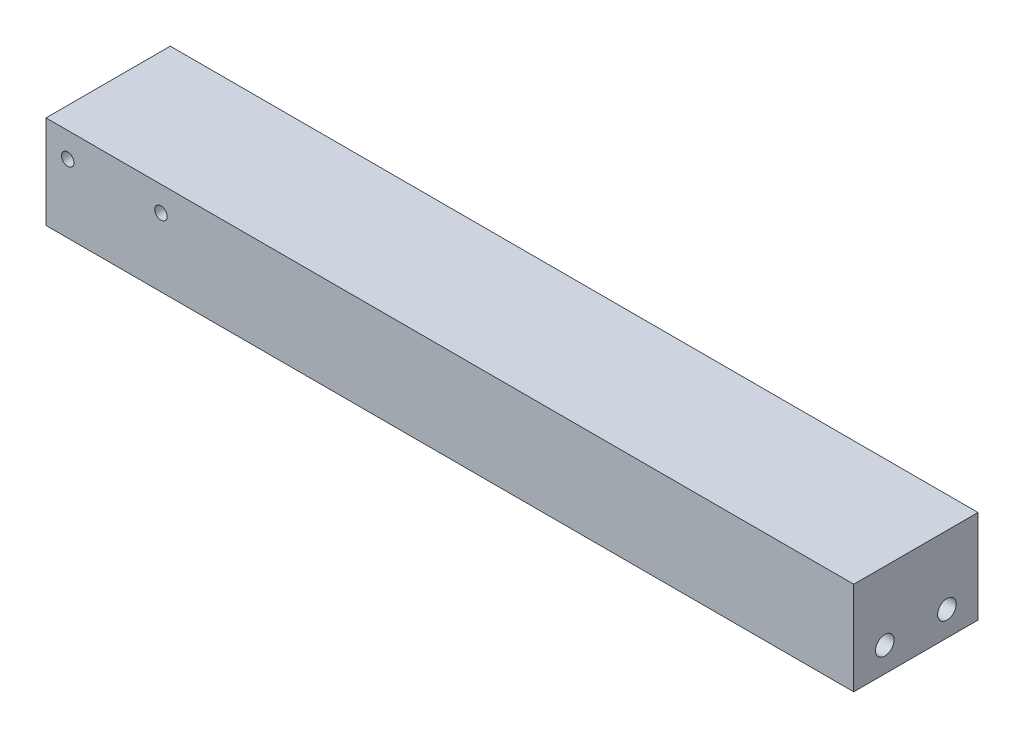
ISO-10303-21;
HEADER;
FILE_DESCRIPTION(('STEP AP214'),'2;1');
FILE_NAME('part.step','',(''),(''),'','','');
FILE_SCHEMA(('AUTOMOTIVE_DESIGN { 1 0 10303 214 1 1 1 1 }'));
ENDSEC;
DATA;
#1=APPLICATION_CONTEXT('core data for automotive mechanical design processes');
#2=APPLICATION_PROTOCOL_DEFINITION('international standard','automotive_design',2000,#1);
#3=PRODUCT_CONTEXT('',#1,'mechanical');
#4=PRODUCT('Part','Part','',(#3));
#5=PRODUCT_RELATED_PRODUCT_CATEGORY('part','',(#4));
#6=PRODUCT_DEFINITION_FORMATION('','',#4);
#7=PRODUCT_DEFINITION_CONTEXT('part definition',#1,'design');
#8=PRODUCT_DEFINITION('design','',#6,#7);
#9=PRODUCT_DEFINITION_SHAPE('','',#8);
#10=(LENGTH_UNIT() NAMED_UNIT(*) SI_UNIT(.MILLI.,.METRE.));
#11=(NAMED_UNIT(*) PLANE_ANGLE_UNIT() SI_UNIT($,.RADIAN.));
#12=(NAMED_UNIT(*) SI_UNIT($,.STERADIAN.) SOLID_ANGLE_UNIT());
#13=UNCERTAINTY_MEASURE_WITH_UNIT(LENGTH_MEASURE(1.E-05),#10,'distance_accuracy_value','');
#14=(GEOMETRIC_REPRESENTATION_CONTEXT(3) GLOBAL_UNCERTAINTY_ASSIGNED_CONTEXT((#13)) GLOBAL_UNIT_ASSIGNED_CONTEXT((#10,
#11,#12)) REPRESENTATION_CONTEXT('',''));
#15=CARTESIAN_POINT('',(0.,0.,0.));
#16=DIRECTION('',(0.,0.,1.));
#17=DIRECTION('',(1.,0.,0.));
#18=AXIS2_PLACEMENT_3D('',#15,#16,#17);
#19=CARTESIAN_POINT('',(0.,0.,40.));
#20=DIRECTION('',(1.,0.,0.));
#21=DIRECTION('',(0.,0.,-1.));
#22=AXIS2_PLACEMENT_3D('',#19,#20,#21);
#23=PLANE('',#22);
#24=CARTESIAN_POINT('',(0.,8.,10.));
#25=DIRECTION('',(1.,0.,0.));
#26=DIRECTION('',(0.,0.,-1.));
#27=AXIS2_PLACEMENT_3D('',#24,#25,#26);
#28=CIRCLE('',#27,3.);
#29=CARTESIAN_POINT('',(0.,8.,7.));
#30=VERTEX_POINT('',#29);
#31=EDGE_CURVE('E118',#30,#30,#28,.T.);
#32=ORIENTED_EDGE('',*,*,#31,.T.);
#33=EDGE_LOOP('',(#32));
#34=FACE_BOUND('',#33,.T.);
#35=CARTESIAN_POINT('',(0.,8.,30.));
#36=DIRECTION('',(1.,0.,0.));
#37=DIRECTION('',(0.,0.,-1.));
#38=AXIS2_PLACEMENT_3D('',#35,#36,#37);
#39=CIRCLE('',#38,3.);
#40=CARTESIAN_POINT('',(0.,8.,27.));
#41=VERTEX_POINT('',#40);
#42=EDGE_CURVE('E129',#41,#41,#39,.T.);
#43=ORIENTED_EDGE('',*,*,#42,.T.);
#44=EDGE_LOOP('',(#43));
#45=FACE_BOUND('',#44,.T.);
#46=DIRECTION('',(0.,-1.,0.));
#47=VECTOR('',#46,1.);
#48=CARTESIAN_POINT('',(0.,0.,0.));
#49=LINE('',#48,#47);
#50=CARTESIAN_POINT('',(0.,30.,0.));
#51=VERTEX_POINT('',#50);
#52=CARTESIAN_POINT('',(0.,0.,0.));
#53=VERTEX_POINT('',#52);
#54=EDGE_CURVE('E100',#51,#53,#49,.T.);
#55=ORIENTED_EDGE('',*,*,#54,.T.);
#56=DIRECTION('',(0.,0.,-1.));
#57=VECTOR('',#56,1.);
#58=CARTESIAN_POINT('',(0.,0.,40.));
#59=LINE('',#58,#57);
#60=CARTESIAN_POINT('',(0.,0.,40.));
#61=VERTEX_POINT('',#60);
#62=EDGE_CURVE('E11',#61,#53,#59,.T.);
#63=ORIENTED_EDGE('',*,*,#62,.F.);
#64=DIRECTION('',(0.,-1.,0.));
#65=VECTOR('',#64,1.);
#66=CARTESIAN_POINT('',(0.,0.,40.));
#67=LINE('',#66,#65);
#68=CARTESIAN_POINT('',(0.,30.,40.));
#69=VERTEX_POINT('',#68);
#70=EDGE_CURVE('E88',#69,#61,#67,.T.);
#71=ORIENTED_EDGE('',*,*,#70,.F.);
#72=DIRECTION('',(0.,0.,-1.));
#73=VECTOR('',#72,1.);
#74=CARTESIAN_POINT('',(0.,30.,40.));
#75=LINE('',#74,#73);
#76=EDGE_CURVE('E96',#69,#51,#75,.T.);
#77=ORIENTED_EDGE('',*,*,#76,.T.);
#78=EDGE_LOOP('',(#55,#63,#71,#77));
#79=FACE_BOUND('',#78,.T.);
#80=ADVANCED_FACE('F37',(#34,#45,#79),#23,.F.);
#81=CARTESIAN_POINT('',(0.,0.,40.));
#82=DIRECTION('',(0.,1.,0.));
#83=DIRECTION('',(0.,0.,1.));
#84=AXIS2_PLACEMENT_3D('',#81,#82,#83);
#85=PLANE('',#84);
#86=DIRECTION('',(1.,0.,0.));
#87=VECTOR('',#86,1.);
#88=CARTESIAN_POINT('',(0.,0.,0.));
#89=LINE('',#88,#87);
#90=CARTESIAN_POINT('',(260.,0.,0.));
#91=VERTEX_POINT('',#90);
#92=EDGE_CURVE('E92',#53,#91,#89,.T.);
#93=ORIENTED_EDGE('',*,*,#92,.T.);
#94=DIRECTION('',(0.,0.,-1.));
#95=VECTOR('',#94,1.);
#96=CARTESIAN_POINT('',(260.,0.,40.));
#97=LINE('',#96,#95);
#98=CARTESIAN_POINT('',(260.,0.,40.));
#99=VERTEX_POINT('',#98);
#100=EDGE_CURVE('E45',#99,#91,#97,.T.);
#101=ORIENTED_EDGE('',*,*,#100,.F.);
#102=DIRECTION('',(1.,0.,0.));
#103=VECTOR('',#102,1.);
#104=CARTESIAN_POINT('',(0.,0.,40.));
#105=LINE('',#104,#103);
#106=EDGE_CURVE('E83',#61,#99,#105,.T.);
#107=ORIENTED_EDGE('',*,*,#106,.F.);
#108=ORIENTED_EDGE('',*,*,#62,.T.);
#109=EDGE_LOOP('',(#93,#101,#107,#108));
#110=FACE_BOUND('',#109,.T.);
#111=ADVANCED_FACE('F91',(#110),#85,.F.);
#112=CARTESIAN_POINT('',(260.,0.,40.));
#113=DIRECTION('',(-1.,0.,0.));
#114=DIRECTION('',(0.,0.,1.));
#115=AXIS2_PLACEMENT_3D('',#112,#113,#114);
#116=PLANE('',#115);
#117=CARTESIAN_POINT('',(260.,8.,10.));
#118=DIRECTION('',(1.,0.,0.));
#119=DIRECTION('',(0.,0.,-1.));
#120=AXIS2_PLACEMENT_3D('',#117,#118,#119);
#121=CIRCLE('',#120,3.);
#122=CARTESIAN_POINT('',(260.,8.,7.));
#123=VERTEX_POINT('',#122);
#124=EDGE_CURVE('E132',#123,#123,#121,.T.);
#125=ORIENTED_EDGE('',*,*,#124,.F.);
#126=EDGE_LOOP('',(#125));
#127=FACE_BOUND('',#126,.T.);
#128=CARTESIAN_POINT('',(260.,8.,30.));
#129=DIRECTION('',(1.,0.,0.));
#130=DIRECTION('',(0.,0.,-1.));
#131=AXIS2_PLACEMENT_3D('',#128,#129,#130);
#132=CIRCLE('',#131,3.);
#133=CARTESIAN_POINT('',(260.,8.,27.));
#134=VERTEX_POINT('',#133);
#135=EDGE_CURVE('E126',#134,#134,#132,.T.);
#136=ORIENTED_EDGE('',*,*,#135,.F.);
#137=EDGE_LOOP('',(#136));
#138=FACE_BOUND('',#137,.T.);
#139=DIRECTION('',(0.,1.,0.));
#140=VECTOR('',#139,1.);
#141=CARTESIAN_POINT('',(260.,0.,0.));
#142=LINE('',#141,#140);
#143=CARTESIAN_POINT('',(260.,30.,0.));
#144=VERTEX_POINT('',#143);
#145=EDGE_CURVE('E70',#91,#144,#142,.T.);
#146=ORIENTED_EDGE('',*,*,#145,.T.);
#147=DIRECTION('',(0.,0.,-1.));
#148=VECTOR('',#147,1.);
#149=CARTESIAN_POINT('',(260.,30.,40.));
#150=LINE('',#149,#148);
#151=CARTESIAN_POINT('',(260.,30.,40.));
#152=VERTEX_POINT('',#151);
#153=EDGE_CURVE('E93',#152,#144,#150,.T.);
#154=ORIENTED_EDGE('',*,*,#153,.F.);
#155=DIRECTION('',(0.,1.,0.));
#156=VECTOR('',#155,1.);
#157=CARTESIAN_POINT('',(260.,0.,40.));
#158=LINE('',#157,#156);
#159=EDGE_CURVE('E86',#99,#152,#158,.T.);
#160=ORIENTED_EDGE('',*,*,#159,.F.);
#161=ORIENTED_EDGE('',*,*,#100,.T.);
#162=EDGE_LOOP('',(#146,#154,#160,#161));
#163=FACE_BOUND('',#162,.T.);
#164=ADVANCED_FACE('F94',(#127,#138,#163),#116,.F.);
#165=CARTESIAN_POINT('',(0.,30.,40.));
#166=DIRECTION('',(0.,-1.,0.));
#167=DIRECTION('',(0.,0.,-1.));
#168=AXIS2_PLACEMENT_3D('',#165,#166,#167);
#169=PLANE('',#168);
#170=DIRECTION('',(-1.,0.,0.));
#171=VECTOR('',#170,1.);
#172=CARTESIAN_POINT('',(0.,30.,0.));
#173=LINE('',#172,#171);
#174=EDGE_CURVE('E76',#144,#51,#173,.T.);
#175=ORIENTED_EDGE('',*,*,#174,.T.);
#176=ORIENTED_EDGE('',*,*,#76,.F.);
#177=DIRECTION('',(-1.,0.,0.));
#178=VECTOR('',#177,1.);
#179=CARTESIAN_POINT('',(0.,30.,40.));
#180=LINE('',#179,#178);
#181=EDGE_CURVE('E53',#152,#69,#180,.T.);
#182=ORIENTED_EDGE('',*,*,#181,.F.);
#183=ORIENTED_EDGE('',*,*,#153,.T.);
#184=EDGE_LOOP('',(#175,#176,#182,#183));
#185=FACE_BOUND('',#184,.T.);
#186=ADVANCED_FACE('F108',(#185),#169,.F.);
#187=CARTESIAN_POINT('',(0.,0.,40.));
#188=DIRECTION('',(0.,0.,-1.));
#189=DIRECTION('',(-1.,0.,0.));
#190=AXIS2_PLACEMENT_3D('',#187,#188,#189);
#191=PLANE('',#190);
#192=CARTESIAN_POINT('',(7.00000000000001,22.,40.));
#193=DIRECTION('',(0.,0.,1.));
#194=DIRECTION('',(1.,0.,0.));
#195=AXIS2_PLACEMENT_3D('',#192,#193,#194);
#196=CIRCLE('',#195,2.);
#197=CARTESIAN_POINT('',(9.,22.,40.));
#198=VERTEX_POINT('',#197);
#199=EDGE_CURVE('E121',#198,#198,#196,.T.);
#200=ORIENTED_EDGE('',*,*,#199,.F.);
#201=EDGE_LOOP('',(#200));
#202=FACE_BOUND('',#201,.T.);
#203=CARTESIAN_POINT('',(37.,22.,40.));
#204=DIRECTION('',(0.,0.,1.));
#205=DIRECTION('',(1.,0.,0.));
#206=AXIS2_PLACEMENT_3D('',#203,#204,#205);
#207=CIRCLE('',#206,2.);
#208=CARTESIAN_POINT('',(39.,22.,40.));
#209=VERTEX_POINT('',#208);
#210=EDGE_CURVE('E114',#209,#209,#207,.T.);
#211=ORIENTED_EDGE('',*,*,#210,.F.);
#212=EDGE_LOOP('',(#211));
#213=FACE_BOUND('',#212,.T.);
#214=ORIENTED_EDGE('',*,*,#70,.T.);
#215=ORIENTED_EDGE('',*,*,#106,.T.);
#216=ORIENTED_EDGE('',*,*,#159,.T.);
#217=ORIENTED_EDGE('',*,*,#181,.T.);
#218=EDGE_LOOP('',(#214,#215,#216,#217));
#219=FACE_BOUND('',#218,.T.);
#220=ADVANCED_FACE('F84',(#202,#213,#219),#191,.F.);
#221=CARTESIAN_POINT('',(0.,0.,0.));
#222=DIRECTION('',(0.,0.,-1.));
#223=DIRECTION('',(-1.,0.,0.));
#224=AXIS2_PLACEMENT_3D('',#221,#222,#223);
#225=PLANE('',#224);
#226=CARTESIAN_POINT('',(7.00000000000001,22.,0.));
#227=DIRECTION('',(0.,0.,1.));
#228=DIRECTION('',(1.,0.,0.));
#229=AXIS2_PLACEMENT_3D('',#226,#227,#228);
#230=CIRCLE('',#229,2.);
#231=CARTESIAN_POINT('',(9.,22.,0.));
#232=VERTEX_POINT('',#231);
#233=EDGE_CURVE('E103',#232,#232,#230,.T.);
#234=ORIENTED_EDGE('',*,*,#233,.T.);
#235=EDGE_LOOP('',(#234));
#236=FACE_BOUND('',#235,.T.);
#237=CARTESIAN_POINT('',(37.,22.,0.));
#238=DIRECTION('',(0.,0.,1.));
#239=DIRECTION('',(1.,0.,0.));
#240=AXIS2_PLACEMENT_3D('',#237,#238,#239);
#241=CIRCLE('',#240,2.);
#242=CARTESIAN_POINT('',(39.,22.,0.));
#243=VERTEX_POINT('',#242);
#244=EDGE_CURVE('E117',#243,#243,#241,.T.);
#245=ORIENTED_EDGE('',*,*,#244,.T.);
#246=EDGE_LOOP('',(#245));
#247=FACE_BOUND('',#246,.T.);
#248=ORIENTED_EDGE('',*,*,#54,.F.);
#249=ORIENTED_EDGE('',*,*,#174,.F.);
#250=ORIENTED_EDGE('',*,*,#145,.F.);
#251=ORIENTED_EDGE('',*,*,#92,.F.);
#252=EDGE_LOOP('',(#248,#249,#250,#251));
#253=FACE_BOUND('',#252,.T.);
#254=ADVANCED_FACE('F111',(#236,#247,#253),#225,.T.);
#255=CARTESIAN_POINT('',(37.,22.,0.));
#256=DIRECTION('',(0.,0.,1.));
#257=DIRECTION('',(1.,0.,0.));
#258=AXIS2_PLACEMENT_3D('',#255,#256,#257);
#259=CYLINDRICAL_SURFACE('',#258,2.);
#260=ORIENTED_EDGE('',*,*,#244,.F.);
#261=EDGE_LOOP('',(#260));
#262=FACE_BOUND('',#261,.T.);
#263=ORIENTED_EDGE('',*,*,#210,.T.);
#264=EDGE_LOOP('',(#263));
#265=FACE_BOUND('',#264,.T.);
#266=ADVANCED_FACE('F159',(#262,#265),#259,.F.);
#267=CARTESIAN_POINT('',(7.00000000000001,22.,0.));
#268=DIRECTION('',(0.,0.,1.));
#269=DIRECTION('',(1.,0.,0.));
#270=AXIS2_PLACEMENT_3D('',#267,#268,#269);
#271=CYLINDRICAL_SURFACE('',#270,2.);
#272=ORIENTED_EDGE('',*,*,#233,.F.);
#273=EDGE_LOOP('',(#272));
#274=FACE_BOUND('',#273,.T.);
#275=ORIENTED_EDGE('',*,*,#199,.T.);
#276=EDGE_LOOP('',(#275));
#277=FACE_BOUND('',#276,.T.);
#278=ADVANCED_FACE('F153',(#274,#277),#271,.F.);
#279=CARTESIAN_POINT('',(0.,8.,30.));
#280=DIRECTION('',(1.,0.,0.));
#281=DIRECTION('',(0.,0.,-1.));
#282=AXIS2_PLACEMENT_3D('',#279,#280,#281);
#283=CYLINDRICAL_SURFACE('',#282,3.);
#284=ORIENTED_EDGE('',*,*,#42,.F.);
#285=EDGE_LOOP('',(#284));
#286=FACE_BOUND('',#285,.T.);
#287=ORIENTED_EDGE('',*,*,#135,.T.);
#288=EDGE_LOOP('',(#287));
#289=FACE_BOUND('',#288,.T.);
#290=ADVANCED_FACE('F143',(#286,#289),#283,.F.);
#291=CARTESIAN_POINT('',(0.,8.,10.));
#292=DIRECTION('',(1.,0.,0.));
#293=DIRECTION('',(0.,0.,-1.));
#294=AXIS2_PLACEMENT_3D('',#291,#292,#293);
#295=CYLINDRICAL_SURFACE('',#294,3.);
#296=ORIENTED_EDGE('',*,*,#31,.F.);
#297=EDGE_LOOP('',(#296));
#298=FACE_BOUND('',#297,.T.);
#299=ORIENTED_EDGE('',*,*,#124,.T.);
#300=EDGE_LOOP('',(#299));
#301=FACE_BOUND('',#300,.T.);
#302=ADVANCED_FACE('F140',(#298,#301),#295,.F.);
#303=CLOSED_SHELL('',(#80,#111,#164,#186,#220,#254,#266,#278,#290,#302));
#304=MANIFOLD_SOLID_BREP('B2',#303);
#305=ADVANCED_BREP_SHAPE_REPRESENTATION('',(#18,#304),#14);
#306=SHAPE_DEFINITION_REPRESENTATION(#9,#305);
ENDSEC;
END-ISO-10303-21;
